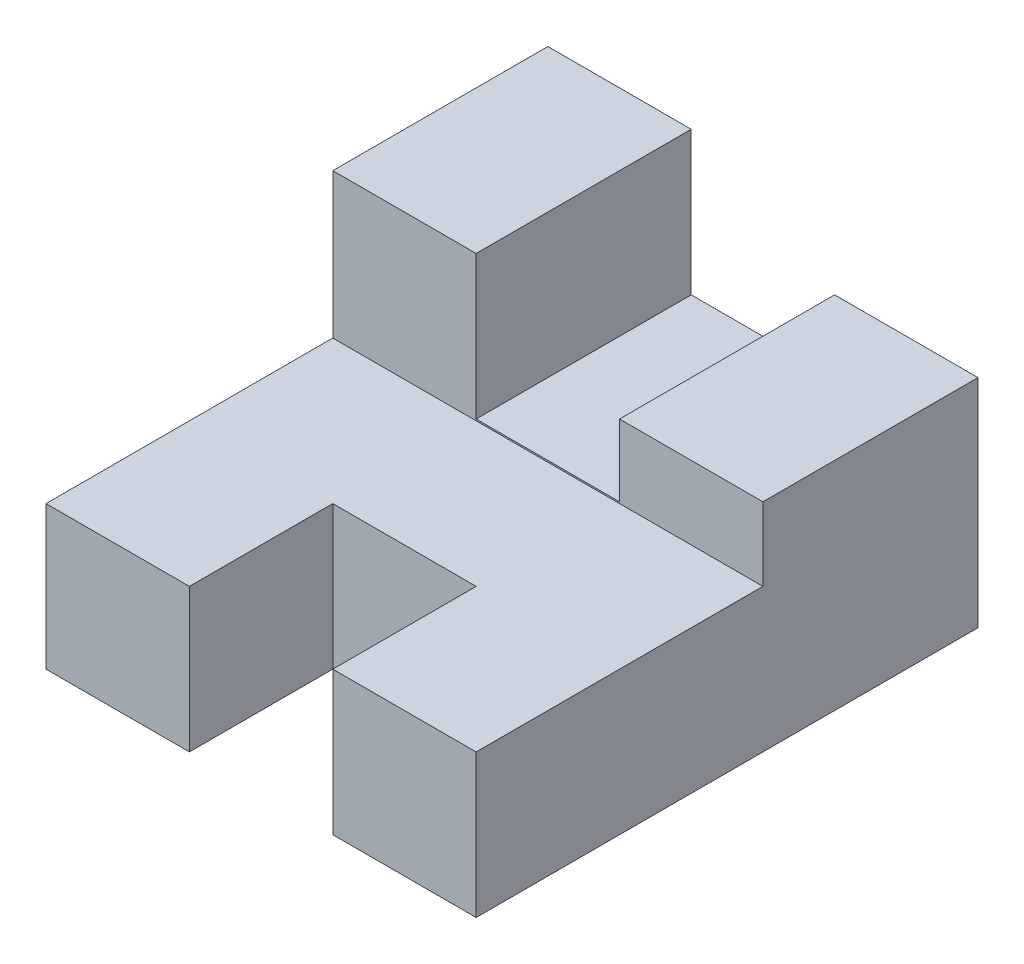
ISO-10303-21;
HEADER;
FILE_DESCRIPTION(('STEP AP214'),'2;1');
FILE_NAME('part.step','',(''),(''),'','','');
FILE_SCHEMA(('AUTOMOTIVE_DESIGN { 1 0 10303 214 1 1 1 1 }'));
ENDSEC;
DATA;
#1=APPLICATION_CONTEXT('core data for automotive mechanical design processes');
#2=APPLICATION_PROTOCOL_DEFINITION('international standard','automotive_design',2000,#1);
#3=PRODUCT_CONTEXT('',#1,'mechanical');
#4=PRODUCT('Part','Part','',(#3));
#5=PRODUCT_RELATED_PRODUCT_CATEGORY('part','',(#4));
#6=PRODUCT_DEFINITION_FORMATION('','',#4);
#7=PRODUCT_DEFINITION_CONTEXT('part definition',#1,'design');
#8=PRODUCT_DEFINITION('design','',#6,#7);
#9=PRODUCT_DEFINITION_SHAPE('','',#8);
#10=(LENGTH_UNIT() NAMED_UNIT(*) SI_UNIT(.MILLI.,.METRE.));
#11=(NAMED_UNIT(*) PLANE_ANGLE_UNIT() SI_UNIT($,.RADIAN.));
#12=(NAMED_UNIT(*) SI_UNIT($,.STERADIAN.) SOLID_ANGLE_UNIT());
#13=UNCERTAINTY_MEASURE_WITH_UNIT(LENGTH_MEASURE(1.E-05),#10,'distance_accuracy_value','');
#14=(GEOMETRIC_REPRESENTATION_CONTEXT(3) GLOBAL_UNCERTAINTY_ASSIGNED_CONTEXT((#13)) GLOBAL_UNIT_ASSIGNED_CONTEXT((#10,
#11,#12)) REPRESENTATION_CONTEXT('',''));
#15=CARTESIAN_POINT('',(0.,0.,0.));
#16=DIRECTION('',(0.,0.,1.));
#17=DIRECTION('',(1.,0.,0.));
#18=AXIS2_PLACEMENT_3D('',#15,#16,#17);
#19=CARTESIAN_POINT('',(60.,0.,40.));
#20=DIRECTION('',(-1.,0.,0.));
#21=DIRECTION('',(0.,0.,1.));
#22=AXIS2_PLACEMENT_3D('',#19,#20,#21);
#23=PLANE('',#22);
#24=DIRECTION('',(0.,0.,-1.));
#25=VECTOR('',#24,1.);
#26=CARTESIAN_POINT('',(60.,30.2164674804587,-30.));
#27=LINE('',#26,#25);
#28=CARTESIAN_POINT('',(60.,30.2164674804587,0.));
#29=VERTEX_POINT('',#28);
#30=CARTESIAN_POINT('',(60.,30.2164674804587,-30.));
#31=VERTEX_POINT('',#30);
#32=EDGE_CURVE('E161',#29,#31,#27,.T.);
#33=ORIENTED_EDGE('',*,*,#32,.F.);
#34=DIRECTION('',(0.,-1.,0.));
#35=VECTOR('',#34,1.);
#36=CARTESIAN_POINT('',(60.,0.,0.));
#37=LINE('',#36,#35);
#38=CARTESIAN_POINT('',(60.,20.,0.));
#39=VERTEX_POINT('',#38);
#40=EDGE_CURVE('E159',#29,#39,#37,.T.);
#41=ORIENTED_EDGE('',*,*,#40,.T.);
#42=DIRECTION('',(0.,0.,-1.));
#43=VECTOR('',#42,1.);
#44=CARTESIAN_POINT('',(60.,20.,40.));
#45=LINE('',#44,#43);
#46=CARTESIAN_POINT('',(60.,20.,40.));
#47=VERTEX_POINT('',#46);
#48=EDGE_CURVE('E259',#47,#39,#45,.T.);
#49=ORIENTED_EDGE('',*,*,#48,.F.);
#50=DIRECTION('',(0.,1.,0.));
#51=VECTOR('',#50,1.);
#52=CARTESIAN_POINT('',(60.,0.,40.));
#53=LINE('',#52,#51);
#54=CARTESIAN_POINT('',(60.,0.,40.));
#55=VERTEX_POINT('',#54);
#56=EDGE_CURVE('E244',#55,#47,#53,.T.);
#57=ORIENTED_EDGE('',*,*,#56,.F.);
#58=DIRECTION('',(0.,0.,-1.));
#59=VECTOR('',#58,1.);
#60=CARTESIAN_POINT('',(60.,0.,40.));
#61=LINE('',#60,#59);
#62=CARTESIAN_POINT('',(60.,0.,-30.));
#63=VERTEX_POINT('',#62);
#64=EDGE_CURVE('E263',#55,#63,#61,.T.);
#65=ORIENTED_EDGE('',*,*,#64,.T.);
#66=DIRECTION('',(0.,-1.,0.));
#67=VECTOR('',#66,1.);
#68=CARTESIAN_POINT('',(60.,0.,-30.));
#69=LINE('',#68,#67);
#70=EDGE_CURVE('E177',#31,#63,#69,.T.);
#71=ORIENTED_EDGE('',*,*,#70,.F.);
#72=EDGE_LOOP('',(#33,#41,#49,#57,#65,#71));
#73=FACE_BOUND('',#72,.T.);
#74=ADVANCED_FACE('F43',(#73),#23,.F.);
#75=CARTESIAN_POINT('',(0.,0.,0.));
#76=DIRECTION('',(0.,0.,1.));
#77=DIRECTION('',(1.,0.,0.));
#78=AXIS2_PLACEMENT_3D('',#75,#76,#77);
#79=PLANE('',#78);
#80=ORIENTED_EDGE('',*,*,#40,.F.);
#81=DIRECTION('',(1.,0.,0.));
#82=VECTOR('',#81,1.);
#83=CARTESIAN_POINT('',(40.,30.2164674804587,0.));
#84=LINE('',#83,#82);
#85=CARTESIAN_POINT('',(40.,30.2164674804587,0.));
#86=VERTEX_POINT('',#85);
#87=EDGE_CURVE('E145',#86,#29,#84,.T.);
#88=ORIENTED_EDGE('',*,*,#87,.F.);
#89=DIRECTION('',(0.,1.,0.));
#90=VECTOR('',#89,1.);
#91=CARTESIAN_POINT('',(40.,20.2164674804587,0.));
#92=LINE('',#91,#90);
#93=CARTESIAN_POINT('',(40.,20.2164674804587,0.));
#94=VERTEX_POINT('',#93);
#95=EDGE_CURVE('E157',#94,#86,#92,.T.);
#96=ORIENTED_EDGE('',*,*,#95,.F.);
#97=DIRECTION('',(1.,0.,0.));
#98=VECTOR('',#97,1.);
#99=CARTESIAN_POINT('',(20.,20.2164674804587,0.));
#100=LINE('',#99,#98);
#101=CARTESIAN_POINT('',(20.,20.2164674804587,0.));
#102=VERTEX_POINT('',#101);
#103=EDGE_CURVE('E294',#102,#94,#100,.T.);
#104=ORIENTED_EDGE('',*,*,#103,.F.);
#105=DIRECTION('',(0.,1.,0.));
#106=VECTOR('',#105,1.);
#107=CARTESIAN_POINT('',(20.,20.2164674804587,0.));
#108=LINE('',#107,#106);
#109=CARTESIAN_POINT('',(20.,40.2164674804587,0.));
#110=VERTEX_POINT('',#109);
#111=EDGE_CURVE('E196',#102,#110,#108,.T.);
#112=ORIENTED_EDGE('',*,*,#111,.T.);
#113=DIRECTION('',(1.,0.,0.));
#114=VECTOR('',#113,1.);
#115=CARTESIAN_POINT('',(60.,40.2164674804587,0.));
#116=LINE('',#115,#114);
#117=CARTESIAN_POINT('',(0.,40.2164674804587,0.));
#118=VERTEX_POINT('',#117);
#119=EDGE_CURVE('E181',#118,#110,#116,.T.);
#120=ORIENTED_EDGE('',*,*,#119,.F.);
#121=DIRECTION('',(0.,1.,0.));
#122=VECTOR('',#121,1.);
#123=CARTESIAN_POINT('',(0.,0.,0.));
#124=LINE('',#123,#122);
#125=CARTESIAN_POINT('',(0.,20.,0.));
#126=VERTEX_POINT('',#125);
#127=EDGE_CURVE('E195',#126,#118,#124,.T.);
#128=ORIENTED_EDGE('',*,*,#127,.F.);
#129=DIRECTION('',(-1.,0.,0.));
#130=VECTOR('',#129,1.);
#131=CARTESIAN_POINT('',(0.,20.,0.));
#132=LINE('',#131,#130);
#133=EDGE_CURVE('E234',#39,#126,#132,.T.);
#134=ORIENTED_EDGE('',*,*,#133,.F.);
#135=EDGE_LOOP('',(#80,#88,#96,#104,#112,#120,#128,#134));
#136=FACE_BOUND('',#135,.T.);
#137=ADVANCED_FACE('F155',(#136),#79,.T.);
#138=CARTESIAN_POINT('',(0.,0.,-30.));
#139=DIRECTION('',(0.,0.,1.));
#140=DIRECTION('',(1.,0.,0.));
#141=AXIS2_PLACEMENT_3D('',#138,#139,#140);
#142=PLANE('',#141);
#143=DIRECTION('',(-1.,0.,0.));
#144=VECTOR('',#143,1.);
#145=CARTESIAN_POINT('',(40.,30.2164674804587,-30.));
#146=LINE('',#145,#144);
#147=CARTESIAN_POINT('',(40.,30.2164674804587,-30.));
#148=VERTEX_POINT('',#147);
#149=EDGE_CURVE('E59',#31,#148,#146,.T.);
#150=ORIENTED_EDGE('',*,*,#149,.F.);
#151=ORIENTED_EDGE('',*,*,#70,.T.);
#152=DIRECTION('',(-1.,0.,0.));
#153=VECTOR('',#152,1.);
#154=CARTESIAN_POINT('',(60.,0.,-30.));
#155=LINE('',#154,#153);
#156=CARTESIAN_POINT('',(0.,0.,-30.));
#157=VERTEX_POINT('',#156);
#158=EDGE_CURVE('E180',#63,#157,#155,.T.);
#159=ORIENTED_EDGE('',*,*,#158,.T.);
#160=DIRECTION('',(0.,1.,0.));
#161=VECTOR('',#160,1.);
#162=CARTESIAN_POINT('',(0.,0.,-30.));
#163=LINE('',#162,#161);
#164=CARTESIAN_POINT('',(0.,40.2164674804587,-30.));
#165=VERTEX_POINT('',#164);
#166=EDGE_CURVE('E185',#157,#165,#163,.T.);
#167=ORIENTED_EDGE('',*,*,#166,.T.);
#168=DIRECTION('',(1.,0.,0.));
#169=VECTOR('',#168,1.);
#170=CARTESIAN_POINT('',(60.,40.2164674804587,-30.));
#171=LINE('',#170,#169);
#172=CARTESIAN_POINT('',(20.,40.2164674804587,-30.));
#173=VERTEX_POINT('',#172);
#174=EDGE_CURVE('E188',#165,#173,#171,.T.);
#175=ORIENTED_EDGE('',*,*,#174,.T.);
#176=DIRECTION('',(0.,1.,0.));
#177=VECTOR('',#176,1.);
#178=CARTESIAN_POINT('',(20.,20.2164674804587,-30.));
#179=LINE('',#178,#177);
#180=CARTESIAN_POINT('',(20.,20.2164674804587,-30.));
#181=VERTEX_POINT('',#180);
#182=EDGE_CURVE('E170',#181,#173,#179,.T.);
#183=ORIENTED_EDGE('',*,*,#182,.F.);
#184=DIRECTION('',(-1.,0.,0.));
#185=VECTOR('',#184,1.);
#186=CARTESIAN_POINT('',(20.,20.2164674804587,-30.));
#187=LINE('',#186,#185);
#188=CARTESIAN_POINT('',(40.,20.2164674804587,-30.));
#189=VERTEX_POINT('',#188);
#190=EDGE_CURVE('E173',#189,#181,#187,.T.);
#191=ORIENTED_EDGE('',*,*,#190,.F.);
#192=DIRECTION('',(0.,1.,0.));
#193=VECTOR('',#192,1.);
#194=CARTESIAN_POINT('',(40.,20.2164674804587,-30.));
#195=LINE('',#194,#193);
#196=EDGE_CURVE('E165',#189,#148,#195,.T.);
#197=ORIENTED_EDGE('',*,*,#196,.T.);
#198=EDGE_LOOP('',(#150,#151,#159,#167,#175,#183,#191,#197));
#199=FACE_BOUND('',#198,.T.);
#200=ADVANCED_FACE('F308',(#199),#142,.F.);
#201=CARTESIAN_POINT('',(40.,20.2164674804587,-30.));
#202=DIRECTION('',(1.,0.,0.));
#203=DIRECTION('',(0.,0.,-1.));
#204=AXIS2_PLACEMENT_3D('',#201,#202,#203);
#205=PLANE('',#204);
#206=DIRECTION('',(0.,0.,1.));
#207=VECTOR('',#206,1.);
#208=CARTESIAN_POINT('',(40.,30.2164674804587,-30.));
#209=LINE('',#208,#207);
#210=EDGE_CURVE('E142',#148,#86,#209,.T.);
#211=ORIENTED_EDGE('',*,*,#210,.F.);
#212=ORIENTED_EDGE('',*,*,#196,.F.);
#213=DIRECTION('',(0.,0.,-1.));
#214=VECTOR('',#213,1.);
#215=CARTESIAN_POINT('',(40.,20.2164674804587,-30.));
#216=LINE('',#215,#214);
#217=EDGE_CURVE('E67',#94,#189,#216,.T.);
#218=ORIENTED_EDGE('',*,*,#217,.F.);
#219=ORIENTED_EDGE('',*,*,#95,.T.);
#220=EDGE_LOOP('',(#211,#212,#218,#219));
#221=FACE_BOUND('',#220,.T.);
#222=ADVANCED_FACE('F163',(#221),#205,.F.);
#223=CARTESIAN_POINT('',(60.,40.2164674804587,-30.));
#224=DIRECTION('',(0.,-1.,0.));
#225=DIRECTION('',(0.,0.,-1.));
#226=AXIS2_PLACEMENT_3D('',#223,#224,#225);
#227=PLANE('',#226);
#228=ORIENTED_EDGE('',*,*,#119,.T.);
#229=DIRECTION('',(0.,0.,1.));
#230=VECTOR('',#229,1.);
#231=CARTESIAN_POINT('',(20.,40.2164674804587,-30.));
#232=LINE('',#231,#230);
#233=EDGE_CURVE('E292',#173,#110,#232,.T.);
#234=ORIENTED_EDGE('',*,*,#233,.F.);
#235=ORIENTED_EDGE('',*,*,#174,.F.);
#236=DIRECTION('',(0.,0.,1.));
#237=VECTOR('',#236,1.);
#238=CARTESIAN_POINT('',(0.,40.2164674804587,-30.));
#239=LINE('',#238,#237);
#240=EDGE_CURVE('E192',#165,#118,#239,.T.);
#241=ORIENTED_EDGE('',*,*,#240,.T.);
#242=EDGE_LOOP('',(#228,#234,#235,#241));
#243=FACE_BOUND('',#242,.T.);
#244=ADVANCED_FACE('F324',(#243),#227,.F.);
#245=CARTESIAN_POINT('',(0.,0.,40.));
#246=DIRECTION('',(0.,0.,-1.));
#247=DIRECTION('',(-1.,0.,0.));
#248=AXIS2_PLACEMENT_3D('',#245,#246,#247);
#249=PLANE('',#248);
#250=DIRECTION('',(-1.,0.,0.));
#251=VECTOR('',#250,1.);
#252=CARTESIAN_POINT('',(0.,20.,40.));
#253=LINE('',#252,#251);
#254=CARTESIAN_POINT('',(40.,20.,40.));
#255=VERTEX_POINT('',#254);
#256=EDGE_CURVE('E248',#47,#255,#253,.T.);
#257=ORIENTED_EDGE('',*,*,#256,.T.);
#258=DIRECTION('',(0.,-1.,0.));
#259=VECTOR('',#258,1.);
#260=CARTESIAN_POINT('',(40.,0.,40.));
#261=LINE('',#260,#259);
#262=CARTESIAN_POINT('',(40.,0.,40.));
#263=VERTEX_POINT('',#262);
#264=EDGE_CURVE('E11',#255,#263,#261,.T.);
#265=ORIENTED_EDGE('',*,*,#264,.T.);
#266=DIRECTION('',(1.,0.,0.));
#267=VECTOR('',#266,1.);
#268=CARTESIAN_POINT('',(0.,0.,40.));
#269=LINE('',#268,#267);
#270=EDGE_CURVE('E239',#263,#55,#269,.T.);
#271=ORIENTED_EDGE('',*,*,#270,.T.);
#272=ORIENTED_EDGE('',*,*,#56,.T.);
#273=EDGE_LOOP('',(#257,#265,#271,#272));
#274=FACE_BOUND('',#273,.T.);
#275=ADVANCED_FACE('F330',(#274),#249,.F.);
#276=CARTESIAN_POINT('',(0.,0.,40.));
#277=DIRECTION('',(1.,0.,0.));
#278=DIRECTION('',(0.,0.,-1.));
#279=AXIS2_PLACEMENT_3D('',#276,#277,#278);
#280=PLANE('',#279);
#281=DIRECTION('',(0.,0.,-1.));
#282=VECTOR('',#281,1.);
#283=CARTESIAN_POINT('',(0.,20.,40.));
#284=LINE('',#283,#282);
#285=CARTESIAN_POINT('',(0.,20.,40.));
#286=VERTEX_POINT('',#285);
#287=EDGE_CURVE('E252',#286,#126,#284,.T.);
#288=ORIENTED_EDGE('',*,*,#287,.T.);
#289=ORIENTED_EDGE('',*,*,#127,.T.);
#290=ORIENTED_EDGE('',*,*,#240,.F.);
#291=ORIENTED_EDGE('',*,*,#166,.F.);
#292=DIRECTION('',(0.,0.,-1.));
#293=VECTOR('',#292,1.);
#294=CARTESIAN_POINT('',(0.,0.,40.));
#295=LINE('',#294,#293);
#296=CARTESIAN_POINT('',(0.,0.,40.));
#297=VERTEX_POINT('',#296);
#298=EDGE_CURVE('E267',#297,#157,#295,.T.);
#299=ORIENTED_EDGE('',*,*,#298,.F.);
#300=DIRECTION('',(0.,-1.,0.));
#301=VECTOR('',#300,1.);
#302=CARTESIAN_POINT('',(0.,0.,40.));
#303=LINE('',#302,#301);
#304=EDGE_CURVE('E235',#286,#297,#303,.T.);
#305=ORIENTED_EDGE('',*,*,#304,.F.);
#306=EDGE_LOOP('',(#288,#289,#290,#291,#299,#305));
#307=FACE_BOUND('',#306,.T.);
#308=ADVANCED_FACE('F45',(#307),#280,.F.);
#309=CARTESIAN_POINT('',(0.,0.,40.));
#310=DIRECTION('',(0.,1.,0.));
#311=DIRECTION('',(0.,0.,1.));
#312=AXIS2_PLACEMENT_3D('',#309,#310,#311);
#313=PLANE('',#312);
#314=ORIENTED_EDGE('',*,*,#270,.F.);
#315=DIRECTION('',(0.,0.,-1.));
#316=VECTOR('',#315,1.);
#317=CARTESIAN_POINT('',(40.,0.,40.));
#318=LINE('',#317,#316);
#319=CARTESIAN_POINT('',(40.,0.,20.));
#320=VERTEX_POINT('',#319);
#321=EDGE_CURVE('E226',#263,#320,#318,.T.);
#322=ORIENTED_EDGE('',*,*,#321,.T.);
#323=DIRECTION('',(-1.,0.,0.));
#324=VECTOR('',#323,1.);
#325=CARTESIAN_POINT('',(0.,0.,20.));
#326=LINE('',#325,#324);
#327=CARTESIAN_POINT('',(20.,0.,20.));
#328=VERTEX_POINT('',#327);
#329=EDGE_CURVE('E230',#320,#328,#326,.T.);
#330=ORIENTED_EDGE('',*,*,#329,.T.);
#331=DIRECTION('',(0.,0.,1.));
#332=VECTOR('',#331,1.);
#333=CARTESIAN_POINT('',(20.,0.,40.));
#334=LINE('',#333,#332);
#335=CARTESIAN_POINT('',(20.,0.,40.));
#336=VERTEX_POINT('',#335);
#337=EDGE_CURVE('E220',#328,#336,#334,.T.);
#338=ORIENTED_EDGE('',*,*,#337,.T.);
#339=EDGE_CURVE('E240',#297,#336,#269,.T.);
#340=ORIENTED_EDGE('',*,*,#339,.F.);
#341=ORIENTED_EDGE('',*,*,#298,.T.);
#342=ORIENTED_EDGE('',*,*,#158,.F.);
#343=ORIENTED_EDGE('',*,*,#64,.F.);
#344=EDGE_LOOP('',(#314,#322,#330,#338,#340,#341,#342,#343));
#345=FACE_BOUND('',#344,.T.);
#346=ADVANCED_FACE('F316',(#345),#313,.F.);
#347=CARTESIAN_POINT('',(0.,20.,40.));
#348=DIRECTION('',(0.,-1.,0.));
#349=DIRECTION('',(0.,0.,-1.));
#350=AXIS2_PLACEMENT_3D('',#347,#348,#349);
#351=PLANE('',#350);
#352=DIRECTION('',(-1.,0.,0.));
#353=VECTOR('',#352,1.);
#354=CARTESIAN_POINT('',(20.,20.,20.));
#355=LINE('',#354,#353);
#356=CARTESIAN_POINT('',(40.,20.,20.));
#357=VERTEX_POINT('',#356);
#358=CARTESIAN_POINT('',(20.,20.,20.));
#359=VERTEX_POINT('',#358);
#360=EDGE_CURVE('E205',#357,#359,#355,.T.);
#361=ORIENTED_EDGE('',*,*,#360,.F.);
#362=DIRECTION('',(0.,0.,-1.));
#363=VECTOR('',#362,1.);
#364=CARTESIAN_POINT('',(40.,20.,20.));
#365=LINE('',#364,#363);
#366=EDGE_CURVE('E212',#255,#357,#365,.T.);
#367=ORIENTED_EDGE('',*,*,#366,.F.);
#368=ORIENTED_EDGE('',*,*,#256,.F.);
#369=ORIENTED_EDGE('',*,*,#48,.T.);
#370=ORIENTED_EDGE('',*,*,#133,.T.);
#371=ORIENTED_EDGE('',*,*,#287,.F.);
#372=CARTESIAN_POINT('',(20.,20.,40.));
#373=VERTEX_POINT('',#372);
#374=EDGE_CURVE('E247',#373,#286,#253,.T.);
#375=ORIENTED_EDGE('',*,*,#374,.F.);
#376=DIRECTION('',(0.,0.,1.));
#377=VECTOR('',#376,1.);
#378=CARTESIAN_POINT('',(20.,20.,40.));
#379=LINE('',#378,#377);
#380=EDGE_CURVE('E209',#359,#373,#379,.T.);
#381=ORIENTED_EDGE('',*,*,#380,.F.);
#382=EDGE_LOOP('',(#361,#367,#368,#369,#370,#371,#375,#381));
#383=FACE_BOUND('',#382,.T.);
#384=ADVANCED_FACE('F279',(#383),#351,.F.);
#385=ORIENTED_EDGE('',*,*,#339,.T.);
#386=DIRECTION('',(0.,1.,0.));
#387=VECTOR('',#386,1.);
#388=CARTESIAN_POINT('',(20.,0.,40.));
#389=LINE('',#388,#387);
#390=EDGE_CURVE('E52',#336,#373,#389,.T.);
#391=ORIENTED_EDGE('',*,*,#390,.T.);
#392=ORIENTED_EDGE('',*,*,#374,.T.);
#393=ORIENTED_EDGE('',*,*,#304,.T.);
#394=EDGE_LOOP('',(#385,#391,#392,#393));
#395=FACE_BOUND('',#394,.T.);
#396=ADVANCED_FACE('F273',(#395),#249,.F.);
#397=CARTESIAN_POINT('',(20.,-20.,20.));
#398=DIRECTION('',(0.,0.,-1.));
#399=DIRECTION('',(-1.,0.,0.));
#400=AXIS2_PLACEMENT_3D('',#397,#398,#399);
#401=PLANE('',#400);
#402=DIRECTION('',(0.,1.,0.));
#403=VECTOR('',#402,1.);
#404=CARTESIAN_POINT('',(40.,-20.,20.));
#405=LINE('',#404,#403);
#406=EDGE_CURVE('E217',#320,#357,#405,.T.);
#407=ORIENTED_EDGE('',*,*,#406,.T.);
#408=ORIENTED_EDGE('',*,*,#360,.T.);
#409=DIRECTION('',(0.,1.,0.));
#410=VECTOR('',#409,1.);
#411=CARTESIAN_POINT('',(20.,-20.,20.));
#412=LINE('',#411,#410);
#413=EDGE_CURVE('E216',#328,#359,#412,.T.);
#414=ORIENTED_EDGE('',*,*,#413,.F.);
#415=ORIENTED_EDGE('',*,*,#329,.F.);
#416=EDGE_LOOP('',(#407,#408,#414,#415));
#417=FACE_BOUND('',#416,.T.);
#418=ADVANCED_FACE('F335',(#417),#401,.F.);
#419=CARTESIAN_POINT('',(40.,-20.,20.));
#420=DIRECTION('',(1.,0.,0.));
#421=DIRECTION('',(0.,0.,-1.));
#422=AXIS2_PLACEMENT_3D('',#419,#420,#421);
#423=PLANE('',#422);
#424=ORIENTED_EDGE('',*,*,#264,.F.);
#425=ORIENTED_EDGE('',*,*,#366,.T.);
#426=ORIENTED_EDGE('',*,*,#406,.F.);
#427=ORIENTED_EDGE('',*,*,#321,.F.);
#428=EDGE_LOOP('',(#424,#425,#426,#427));
#429=FACE_BOUND('',#428,.T.);
#430=ADVANCED_FACE('F333',(#429),#423,.F.);
#431=CARTESIAN_POINT('',(20.,-20.,40.));
#432=DIRECTION('',(-1.,0.,0.));
#433=DIRECTION('',(0.,0.,1.));
#434=AXIS2_PLACEMENT_3D('',#431,#432,#433);
#435=PLANE('',#434);
#436=ORIENTED_EDGE('',*,*,#413,.T.);
#437=ORIENTED_EDGE('',*,*,#380,.T.);
#438=ORIENTED_EDGE('',*,*,#390,.F.);
#439=ORIENTED_EDGE('',*,*,#337,.F.);
#440=EDGE_LOOP('',(#436,#437,#438,#439));
#441=FACE_BOUND('',#440,.T.);
#442=ADVANCED_FACE('F337',(#441),#435,.F.);
#443=CARTESIAN_POINT('',(20.,20.2164674804587,-30.));
#444=DIRECTION('',(-1.,0.,0.));
#445=DIRECTION('',(0.,0.,1.));
#446=AXIS2_PLACEMENT_3D('',#443,#444,#445);
#447=PLANE('',#446);
#448=ORIENTED_EDGE('',*,*,#233,.T.);
#449=ORIENTED_EDGE('',*,*,#111,.F.);
#450=DIRECTION('',(0.,0.,1.));
#451=VECTOR('',#450,1.);
#452=CARTESIAN_POINT('',(20.,20.2164674804587,-30.));
#453=LINE('',#452,#451);
#454=EDGE_CURVE('E166',#181,#102,#453,.T.);
#455=ORIENTED_EDGE('',*,*,#454,.F.);
#456=ORIENTED_EDGE('',*,*,#182,.T.);
#457=EDGE_LOOP('',(#448,#449,#455,#456));
#458=FACE_BOUND('',#457,.T.);
#459=ADVANCED_FACE('F326',(#458),#447,.F.);
#460=CARTESIAN_POINT('',(0.,20.2164674804587,0.));
#461=DIRECTION('',(0.,-1.,0.));
#462=DIRECTION('',(0.,0.,-1.));
#463=AXIS2_PLACEMENT_3D('',#460,#461,#462);
#464=PLANE('',#463);
#465=ORIENTED_EDGE('',*,*,#103,.T.);
#466=ORIENTED_EDGE('',*,*,#217,.T.);
#467=ORIENTED_EDGE('',*,*,#190,.T.);
#468=ORIENTED_EDGE('',*,*,#454,.T.);
#469=EDGE_LOOP('',(#465,#466,#467,#468));
#470=FACE_BOUND('',#469,.T.);
#471=ADVANCED_FACE('F325',(#470),#464,.F.);
#472=CARTESIAN_POINT('',(0.,30.2164674804587,0.));
#473=DIRECTION('',(0.,1.,0.));
#474=DIRECTION('',(0.,0.,1.));
#475=AXIS2_PLACEMENT_3D('',#472,#473,#474);
#476=PLANE('',#475);
#477=ORIENTED_EDGE('',*,*,#210,.T.);
#478=ORIENTED_EDGE('',*,*,#87,.T.);
#479=ORIENTED_EDGE('',*,*,#32,.T.);
#480=ORIENTED_EDGE('',*,*,#149,.T.);
#481=EDGE_LOOP('',(#477,#478,#479,#480));
#482=FACE_BOUND('',#481,.T.);
#483=ADVANCED_FACE('F144',(#482),#476,.T.);
#484=CLOSED_SHELL('',(#74,#137,#200,#222,#244,#275,#308,#346,#384,#396,#418,#430,#442,#459,#471,#483));
#485=MANIFOLD_SOLID_BREP('B2',#484);
#486=ADVANCED_BREP_SHAPE_REPRESENTATION('',(#18,#485),#14);
#487=SHAPE_DEFINITION_REPRESENTATION(#9,#486);
ENDSEC;
END-ISO-10303-21;
